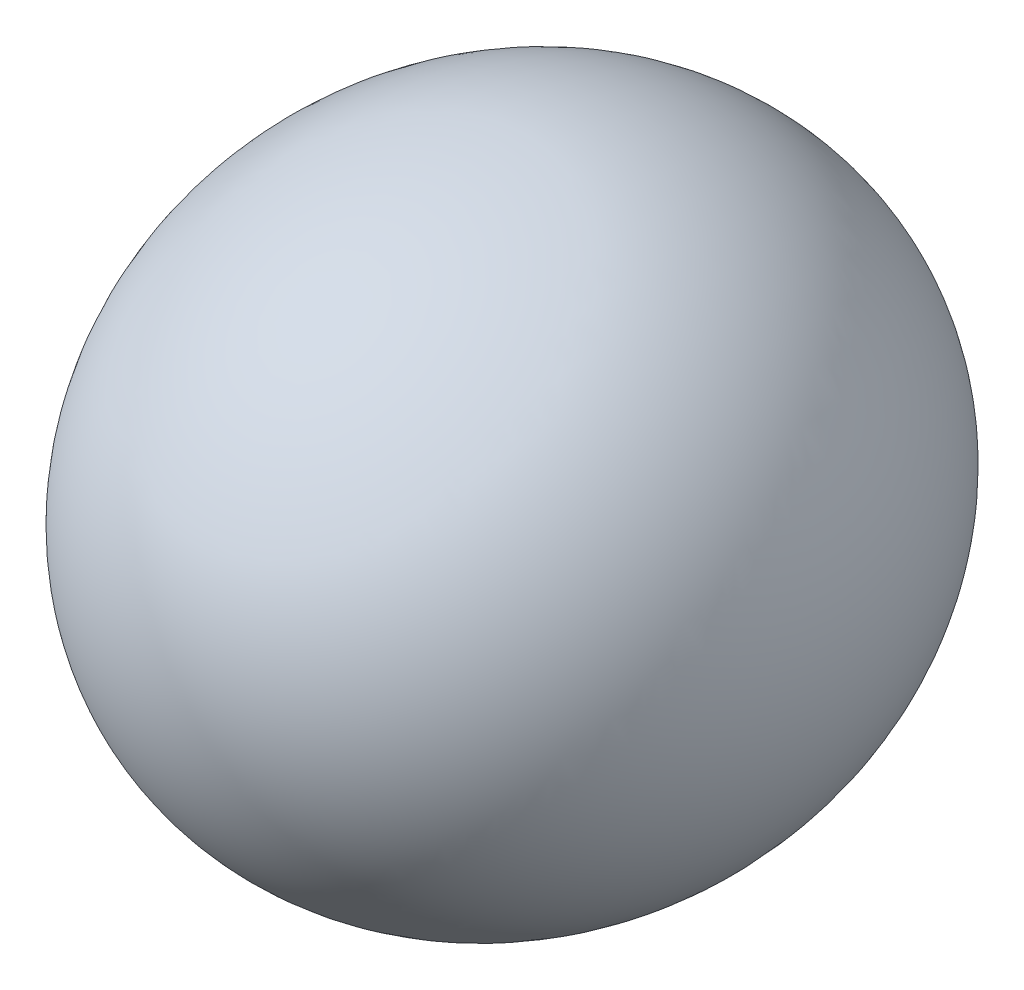
ISO-10303-21;
HEADER;
FILE_DESCRIPTION(('STEP AP214'),'2;1');
FILE_NAME('part.step','',(''),(''),'','','');
FILE_SCHEMA(('AUTOMOTIVE_DESIGN { 1 0 10303 214 1 1 1 1 }'));
ENDSEC;
DATA;
#1=APPLICATION_CONTEXT('core data for automotive mechanical design processes');
#2=APPLICATION_PROTOCOL_DEFINITION('international standard','automotive_design',2000,#1);
#3=PRODUCT_CONTEXT('',#1,'mechanical');
#4=PRODUCT('Part','Part','',(#3));
#5=PRODUCT_RELATED_PRODUCT_CATEGORY('part','',(#4));
#6=PRODUCT_DEFINITION_FORMATION('','',#4);
#7=PRODUCT_DEFINITION_CONTEXT('part definition',#1,'design');
#8=PRODUCT_DEFINITION('design','',#6,#7);
#9=PRODUCT_DEFINITION_SHAPE('','',#8);
#10=(LENGTH_UNIT() NAMED_UNIT(*) SI_UNIT(.MILLI.,.METRE.));
#11=(NAMED_UNIT(*) PLANE_ANGLE_UNIT() SI_UNIT($,.RADIAN.));
#12=(NAMED_UNIT(*) SI_UNIT($,.STERADIAN.) SOLID_ANGLE_UNIT());
#13=UNCERTAINTY_MEASURE_WITH_UNIT(LENGTH_MEASURE(1.E-05),#10,'distance_accuracy_value','');
#14=(GEOMETRIC_REPRESENTATION_CONTEXT(3) GLOBAL_UNCERTAINTY_ASSIGNED_CONTEXT((#13)) GLOBAL_UNIT_ASSIGNED_CONTEXT((#10,
#11,#12)) REPRESENTATION_CONTEXT('',''));
#15=CARTESIAN_POINT('',(0.,0.,0.));
#16=DIRECTION('',(0.,0.,1.));
#17=DIRECTION('',(1.,0.,0.));
#18=AXIS2_PLACEMENT_3D('',#15,#16,#17);
#19=CARTESIAN_POINT('',(0.,0.,0.));
#20=DIRECTION('',(0.,1.,0.));
#21=DIRECTION('',(0.,0.,1.));
#22=AXIS2_PLACEMENT_3D('',#19,#20,#21);
#23=ELLIPSE('',#22,68.6847629936835,61.4357164489546);
#24=TRIMMED_CURVE('',#23,(PARAMETER_VALUE(0.)),(PARAMETER_VALUE(3.1415926535898)),.T.,.PARAMETER.);
#25=CARTESIAN_POINT('',(4.29150186471151E-12,0.,1229.13498547681));
#26=DIRECTION('',(0.,0.,1.));
#27=AXIS1_PLACEMENT('',#25,#26);
#28=SURFACE_OF_REVOLUTION('',#24,#27);
#29=CARTESIAN_POINT('',(-2.39811568255357E-13,0.,-68.6847629936835));
#30=VERTEX_POINT('',#29);
#31=VERTEX_LOOP('',#30);
#32=FACE_BOUND('',#31,.T.);
#33=CARTESIAN_POINT('',(2.39811568255357E-13,0.,68.6847629936835));
#34=VERTEX_POINT('',#33);
#35=VERTEX_LOOP('',#34);
#36=FACE_BOUND('',#35,.T.);
#37=ADVANCED_FACE('F32',(#32,#36),#28,.F.);
#38=CLOSED_SHELL('',(#37));
#39=MANIFOLD_SOLID_BREP('B2',#38);
#40=ADVANCED_BREP_SHAPE_REPRESENTATION('',(#18,#39),#14);
#41=SHAPE_DEFINITION_REPRESENTATION(#9,#40);
ENDSEC;
END-ISO-10303-21;
